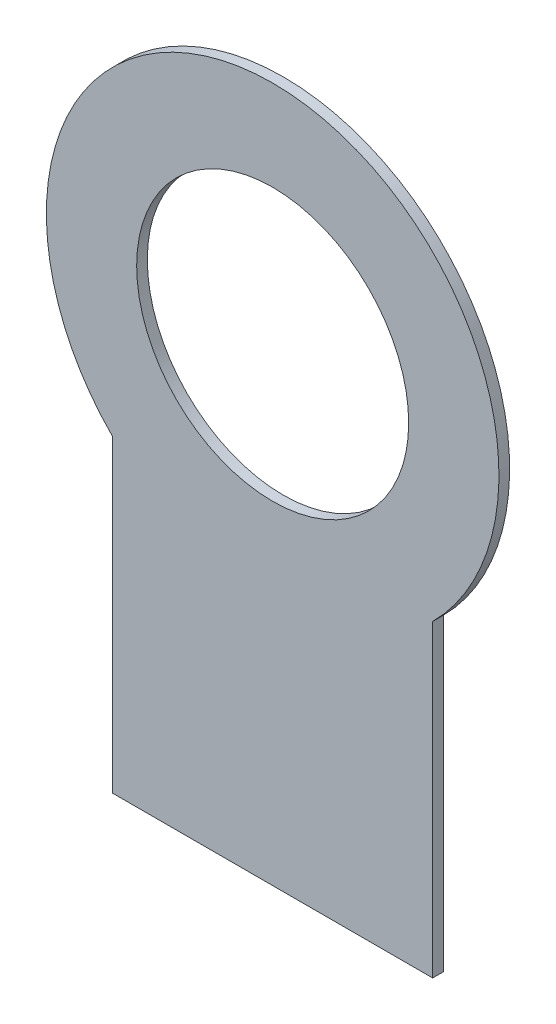
ISO-10303-21;
HEADER;
FILE_DESCRIPTION(('STEP AP214'),'2;1');
FILE_NAME('part.step','',(''),(''),'','','');
FILE_SCHEMA(('AUTOMOTIVE_DESIGN { 1 0 10303 214 1 1 1 1 }'));
ENDSEC;
DATA;
#1=APPLICATION_CONTEXT('core data for automotive mechanical design processes');
#2=APPLICATION_PROTOCOL_DEFINITION('international standard','automotive_design',2000,#1);
#3=PRODUCT_CONTEXT('',#1,'mechanical');
#4=PRODUCT('Part','Part','',(#3));
#5=PRODUCT_RELATED_PRODUCT_CATEGORY('part','',(#4));
#6=PRODUCT_DEFINITION_FORMATION('','',#4);
#7=PRODUCT_DEFINITION_CONTEXT('part definition',#1,'design');
#8=PRODUCT_DEFINITION('design','',#6,#7);
#9=PRODUCT_DEFINITION_SHAPE('','',#8);
#10=(LENGTH_UNIT() NAMED_UNIT(*) SI_UNIT(.MILLI.,.METRE.));
#11=(NAMED_UNIT(*) PLANE_ANGLE_UNIT() SI_UNIT($,.RADIAN.));
#12=(NAMED_UNIT(*) SI_UNIT($,.STERADIAN.) SOLID_ANGLE_UNIT());
#13=UNCERTAINTY_MEASURE_WITH_UNIT(LENGTH_MEASURE(1.E-05),#10,'distance_accuracy_value','');
#14=(GEOMETRIC_REPRESENTATION_CONTEXT(3) GLOBAL_UNCERTAINTY_ASSIGNED_CONTEXT((#13)) GLOBAL_UNIT_ASSIGNED_CONTEXT((#10,
#11,#12)) REPRESENTATION_CONTEXT('',''));
#15=CARTESIAN_POINT('',(0.,0.,0.));
#16=DIRECTION('',(0.,0.,1.));
#17=DIRECTION('',(1.,0.,0.));
#18=AXIS2_PLACEMENT_3D('',#15,#16,#17);
#19=CARTESIAN_POINT('',(30.,0.,2.));
#20=DIRECTION('',(-1.,0.,0.));
#21=DIRECTION('',(0.,0.,1.));
#22=AXIS2_PLACEMENT_3D('',#19,#20,#21);
#23=PLANE('',#22);
#24=DIRECTION('',(0.,1.,0.));
#25=VECTOR('',#24,1.);
#26=CARTESIAN_POINT('',(30.,0.,0.));
#27=LINE('',#26,#25);
#28=CARTESIAN_POINT('',(30.,-87.8915357973521,0.));
#29=VERTEX_POINT('',#28);
#30=CARTESIAN_POINT('',(30.,-30.,0.));
#31=VERTEX_POINT('',#30);
#32=EDGE_CURVE('E107',#29,#31,#27,.T.);
#33=ORIENTED_EDGE('',*,*,#32,.T.);
#34=DIRECTION('',(0.,0.,-1.));
#35=VECTOR('',#34,1.);
#36=CARTESIAN_POINT('',(30.,-30.,2.));
#37=LINE('',#36,#35);
#38=CARTESIAN_POINT('',(30.,-30.,2.));
#39=VERTEX_POINT('',#38);
#40=EDGE_CURVE('E11',#39,#31,#37,.T.);
#41=ORIENTED_EDGE('',*,*,#40,.F.);
#42=DIRECTION('',(0.,1.,0.));
#43=VECTOR('',#42,1.);
#44=CARTESIAN_POINT('',(30.,0.,2.));
#45=LINE('',#44,#43);
#46=CARTESIAN_POINT('',(30.,-87.8915357973521,2.));
#47=VERTEX_POINT('',#46);
#48=EDGE_CURVE('E89',#47,#39,#45,.T.);
#49=ORIENTED_EDGE('',*,*,#48,.F.);
#50=DIRECTION('',(0.,0.,-1.));
#51=VECTOR('',#50,1.);
#52=CARTESIAN_POINT('',(30.,-87.8915357973521,2.));
#53=LINE('',#52,#51);
#54=EDGE_CURVE('E106',#47,#29,#53,.T.);
#55=ORIENTED_EDGE('',*,*,#54,.T.);
#56=EDGE_LOOP('',(#33,#41,#49,#55));
#57=FACE_BOUND('',#56,.T.);
#58=ADVANCED_FACE('F41',(#57),#23,.F.);
#59=CARTESIAN_POINT('',(0.,0.,2.));
#60=DIRECTION('',(0.,0.,-1.));
#61=DIRECTION('',(-1.,0.,0.));
#62=AXIS2_PLACEMENT_3D('',#59,#60,#61);
#63=CYLINDRICAL_SURFACE('',#62,42.4264068711929);
#64=CARTESIAN_POINT('',(0.,0.,0.));
#65=DIRECTION('',(0.,0.,1.));
#66=DIRECTION('',(1.,0.,0.));
#67=AXIS2_PLACEMENT_3D('',#64,#65,#66);
#68=CIRCLE('',#67,42.4264068711929);
#69=CARTESIAN_POINT('',(-30.,-30.,0.));
#70=VERTEX_POINT('',#69);
#71=EDGE_CURVE('E94',#31,#70,#68,.T.);
#72=ORIENTED_EDGE('',*,*,#71,.T.);
#73=DIRECTION('',(0.,0.,-1.));
#74=VECTOR('',#73,1.);
#75=CARTESIAN_POINT('',(-30.,-30.,2.));
#76=LINE('',#75,#74);
#77=CARTESIAN_POINT('',(-30.,-30.,2.));
#78=VERTEX_POINT('',#77);
#79=EDGE_CURVE('E49',#78,#70,#76,.T.);
#80=ORIENTED_EDGE('',*,*,#79,.F.);
#81=CARTESIAN_POINT('',(0.,0.,2.));
#82=DIRECTION('',(0.,0.,1.));
#83=DIRECTION('',(1.,0.,0.));
#84=AXIS2_PLACEMENT_3D('',#81,#82,#83);
#85=CIRCLE('',#84,42.4264068711929);
#86=EDGE_CURVE('E83',#39,#78,#85,.T.);
#87=ORIENTED_EDGE('',*,*,#86,.F.);
#88=ORIENTED_EDGE('',*,*,#40,.T.);
#89=EDGE_LOOP('',(#72,#80,#87,#88));
#90=FACE_BOUND('',#89,.T.);
#91=ADVANCED_FACE('F93',(#90),#63,.T.);
#92=CARTESIAN_POINT('',(-30.,0.,2.));
#93=DIRECTION('',(-1.,0.,0.));
#94=DIRECTION('',(0.,0.,1.));
#95=AXIS2_PLACEMENT_3D('',#92,#93,#94);
#96=PLANE('',#95);
#97=DIRECTION('',(0.,1.,0.));
#98=VECTOR('',#97,1.);
#99=CARTESIAN_POINT('',(-30.,0.,0.));
#100=LINE('',#99,#98);
#101=CARTESIAN_POINT('',(-30.,-87.8915357973521,0.));
#102=VERTEX_POINT('',#101);
#103=EDGE_CURVE('E111',#102,#70,#100,.T.);
#104=ORIENTED_EDGE('',*,*,#103,.F.);
#105=DIRECTION('',(0.,0.,-1.));
#106=VECTOR('',#105,1.);
#107=CARTESIAN_POINT('',(-30.,-87.8915357973521,2.));
#108=LINE('',#107,#106);
#109=CARTESIAN_POINT('',(-30.,-87.8915357973521,2.));
#110=VERTEX_POINT('',#109);
#111=EDGE_CURVE('E73',#110,#102,#108,.T.);
#112=ORIENTED_EDGE('',*,*,#111,.F.);
#113=DIRECTION('',(0.,1.,0.));
#114=VECTOR('',#113,1.);
#115=CARTESIAN_POINT('',(-30.,0.,2.));
#116=LINE('',#115,#114);
#117=EDGE_CURVE('E87',#110,#78,#116,.T.);
#118=ORIENTED_EDGE('',*,*,#117,.T.);
#119=ORIENTED_EDGE('',*,*,#79,.T.);
#120=EDGE_LOOP('',(#104,#112,#118,#119));
#121=FACE_BOUND('',#120,.T.);
#122=ADVANCED_FACE('F98',(#121),#96,.T.);
#123=CARTESIAN_POINT('',(0.,-87.8915357973521,2.));
#124=DIRECTION('',(0.,1.,0.));
#125=DIRECTION('',(0.,0.,1.));
#126=AXIS2_PLACEMENT_3D('',#123,#124,#125);
#127=PLANE('',#126);
#128=DIRECTION('',(1.,0.,0.));
#129=VECTOR('',#128,1.);
#130=CARTESIAN_POINT('',(0.,-87.8915357973521,0.));
#131=LINE('',#130,#129);
#132=EDGE_CURVE('E76',#102,#29,#131,.T.);
#133=ORIENTED_EDGE('',*,*,#132,.T.);
#134=ORIENTED_EDGE('',*,*,#54,.F.);
#135=DIRECTION('',(1.,0.,0.));
#136=VECTOR('',#135,1.);
#137=CARTESIAN_POINT('',(0.,-87.8915357973521,2.));
#138=LINE('',#137,#136);
#139=EDGE_CURVE('E57',#110,#47,#138,.T.);
#140=ORIENTED_EDGE('',*,*,#139,.F.);
#141=ORIENTED_EDGE('',*,*,#111,.T.);
#142=EDGE_LOOP('',(#133,#134,#140,#141));
#143=FACE_BOUND('',#142,.T.);
#144=ADVANCED_FACE('F129',(#143),#127,.F.);
#145=CARTESIAN_POINT('',(0.,0.,2.));
#146=DIRECTION('',(0.,0.,-1.));
#147=DIRECTION('',(-1.,0.,0.));
#148=AXIS2_PLACEMENT_3D('',#145,#146,#147);
#149=CYLINDRICAL_SURFACE('',#148,25.5);
#150=CARTESIAN_POINT('',(0.,0.,2.));
#151=DIRECTION('',(0.,0.,1.));
#152=DIRECTION('',(1.,0.,0.));
#153=AXIS2_PLACEMENT_3D('',#150,#151,#152);
#154=CIRCLE('',#153,25.5);
#155=CARTESIAN_POINT('',(25.5,0.,2.));
#156=VERTEX_POINT('',#155);
#157=EDGE_CURVE('E100',#156,#156,#154,.T.);
#158=ORIENTED_EDGE('',*,*,#157,.T.);
#159=EDGE_LOOP('',(#158));
#160=FACE_BOUND('',#159,.T.);
#161=CARTESIAN_POINT('',(0.,0.,0.));
#162=DIRECTION('',(0.,0.,1.));
#163=DIRECTION('',(1.,0.,0.));
#164=AXIS2_PLACEMENT_3D('',#161,#162,#163);
#165=CIRCLE('',#164,25.5);
#166=CARTESIAN_POINT('',(25.5,0.,0.));
#167=VERTEX_POINT('',#166);
#168=EDGE_CURVE('E114',#167,#167,#165,.T.);
#169=ORIENTED_EDGE('',*,*,#168,.F.);
#170=EDGE_LOOP('',(#169));
#171=FACE_BOUND('',#170,.T.);
#172=ADVANCED_FACE('F127',(#160,#171),#149,.F.);
#173=CARTESIAN_POINT('',(0.,0.,2.));
#174=DIRECTION('',(0.,0.,1.));
#175=DIRECTION('',(1.,0.,0.));
#176=AXIS2_PLACEMENT_3D('',#173,#174,#175);
#177=PLANE('',#176);
#178=ORIENTED_EDGE('',*,*,#48,.T.);
#179=ORIENTED_EDGE('',*,*,#86,.T.);
#180=ORIENTED_EDGE('',*,*,#117,.F.);
#181=ORIENTED_EDGE('',*,*,#139,.T.);
#182=EDGE_LOOP('',(#178,#179,#180,#181));
#183=FACE_BOUND('',#182,.T.);
#184=ORIENTED_EDGE('',*,*,#157,.F.);
#185=EDGE_LOOP('',(#184));
#186=FACE_BOUND('',#185,.T.);
#187=ADVANCED_FACE('F84',(#183,#186),#177,.T.);
#188=CARTESIAN_POINT('',(0.,0.,0.));
#189=DIRECTION('',(0.,0.,1.));
#190=DIRECTION('',(1.,0.,0.));
#191=AXIS2_PLACEMENT_3D('',#188,#189,#190);
#192=PLANE('',#191);
#193=ORIENTED_EDGE('',*,*,#32,.F.);
#194=ORIENTED_EDGE('',*,*,#132,.F.);
#195=ORIENTED_EDGE('',*,*,#103,.T.);
#196=ORIENTED_EDGE('',*,*,#71,.F.);
#197=EDGE_LOOP('',(#193,#194,#195,#196));
#198=FACE_BOUND('',#197,.T.);
#199=ORIENTED_EDGE('',*,*,#168,.T.);
#200=EDGE_LOOP('',(#199));
#201=FACE_BOUND('',#200,.T.);
#202=ADVANCED_FACE('F121',(#198,#201),#192,.F.);
#203=CLOSED_SHELL('',(#58,#91,#122,#144,#172,#187,#202));
#204=MANIFOLD_SOLID_BREP('B2',#203);
#205=ADVANCED_BREP_SHAPE_REPRESENTATION('',(#18,#204),#14);
#206=SHAPE_DEFINITION_REPRESENTATION(#9,#205);
ENDSEC;
END-ISO-10303-21;
